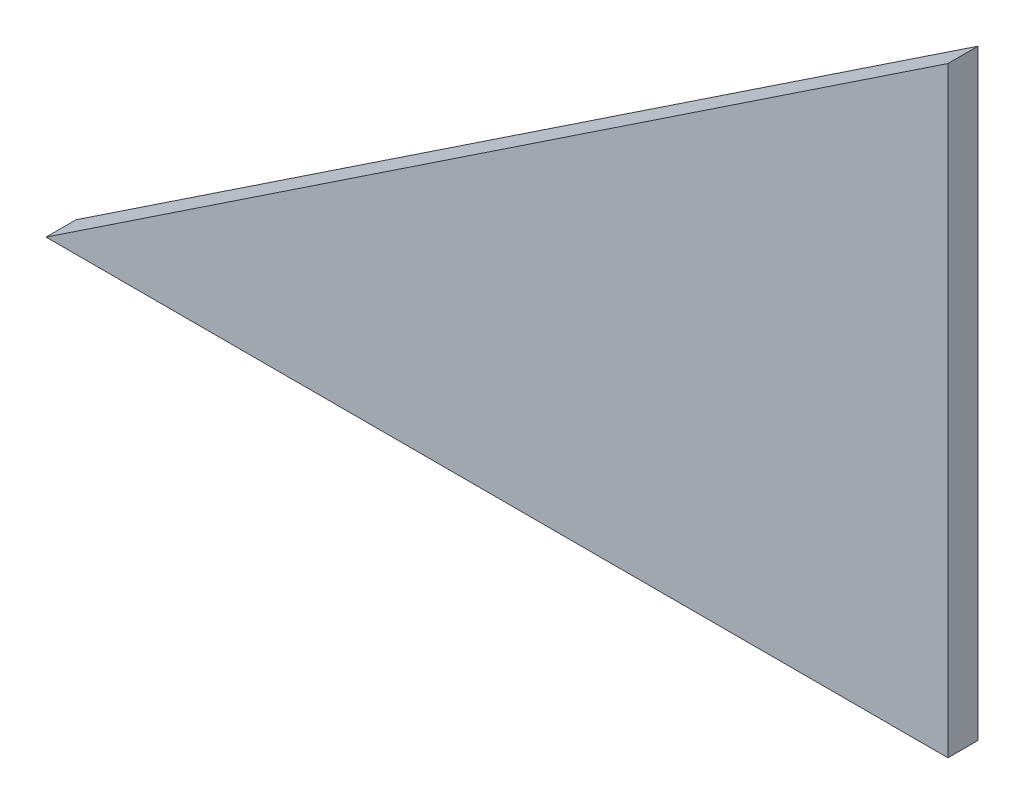
ISO-10303-21;
HEADER;
FILE_DESCRIPTION(('STEP AP214'),'2;1');
FILE_NAME('part.step','',(''),(''),'','','');
FILE_SCHEMA(('AUTOMOTIVE_DESIGN { 1 0 10303 214 1 1 1 1 }'));
ENDSEC;
DATA;
#1=APPLICATION_CONTEXT('core data for automotive mechanical design processes');
#2=APPLICATION_PROTOCOL_DEFINITION('international standard','automotive_design',2000,#1);
#3=PRODUCT_CONTEXT('',#1,'mechanical');
#4=PRODUCT('Part','Part','',(#3));
#5=PRODUCT_RELATED_PRODUCT_CATEGORY('part','',(#4));
#6=PRODUCT_DEFINITION_FORMATION('','',#4);
#7=PRODUCT_DEFINITION_CONTEXT('part definition',#1,'design');
#8=PRODUCT_DEFINITION('design','',#6,#7);
#9=PRODUCT_DEFINITION_SHAPE('','',#8);
#10=(LENGTH_UNIT() NAMED_UNIT(*) SI_UNIT(.MILLI.,.METRE.));
#11=(NAMED_UNIT(*) PLANE_ANGLE_UNIT() SI_UNIT($,.RADIAN.));
#12=(NAMED_UNIT(*) SI_UNIT($,.STERADIAN.) SOLID_ANGLE_UNIT());
#13=UNCERTAINTY_MEASURE_WITH_UNIT(LENGTH_MEASURE(1.E-05),#10,'distance_accuracy_value','');
#14=(GEOMETRIC_REPRESENTATION_CONTEXT(3) GLOBAL_UNCERTAINTY_ASSIGNED_CONTEXT((#13)) GLOBAL_UNIT_ASSIGNED_CONTEXT((#10,
#11,#12)) REPRESENTATION_CONTEXT('',''));
#15=CARTESIAN_POINT('',(0.,0.,0.));
#16=DIRECTION('',(0.,0.,1.));
#17=DIRECTION('',(1.,0.,0.));
#18=AXIS2_PLACEMENT_3D('',#15,#16,#17);
#19=CARTESIAN_POINT('',(158.709631061405,11.9600810738256,22.4064867546874));
#20=DIRECTION('',(0.,1.,0.));
#21=DIRECTION('',(0.,0.,1.));
#22=AXIS2_PLACEMENT_3D('',#19,#20,#21);
#23=PLANE('',#22);
#24=DIRECTION('',(-1.,0.,0.));
#25=VECTOR('',#24,1.);
#26=CARTESIAN_POINT('',(158.709631061405,11.9600810738256,23.6764867546874));
#27=LINE('',#26,#25);
#28=CARTESIAN_POINT('',(196.809631061405,11.9600810738256,23.6764867546874));
#29=VERTEX_POINT('',#28);
#30=CARTESIAN_POINT('',(158.709631061405,11.9600810738256,23.6764867546874));
#31=VERTEX_POINT('',#30);
#32=EDGE_CURVE('E86',#29,#31,#27,.T.);
#33=ORIENTED_EDGE('',*,*,#32,.T.);
#34=DIRECTION('',(0.,0.,1.));
#35=VECTOR('',#34,1.);
#36=CARTESIAN_POINT('',(158.709631061405,11.9600810738256,22.4064867546874));
#37=LINE('',#36,#35);
#38=CARTESIAN_POINT('',(158.709631061405,11.9600810738256,22.4064867546874));
#39=VERTEX_POINT('',#38);
#40=EDGE_CURVE('E11',#39,#31,#37,.T.);
#41=ORIENTED_EDGE('',*,*,#40,.F.);
#42=DIRECTION('',(-1.,0.,0.));
#43=VECTOR('',#42,1.);
#44=CARTESIAN_POINT('',(158.709631061405,11.9600810738256,22.4064867546874));
#45=LINE('',#44,#43);
#46=CARTESIAN_POINT('',(196.809631061405,11.9600810738256,22.4064867546874));
#47=VERTEX_POINT('',#46);
#48=EDGE_CURVE('E78',#47,#39,#45,.T.);
#49=ORIENTED_EDGE('',*,*,#48,.F.);
#50=DIRECTION('',(0.,0.,1.));
#51=VECTOR('',#50,1.);
#52=CARTESIAN_POINT('',(196.809631061405,11.9600810738256,22.4064867546874));
#53=LINE('',#52,#51);
#54=EDGE_CURVE('E87',#47,#29,#53,.T.);
#55=ORIENTED_EDGE('',*,*,#54,.T.);
#56=EDGE_LOOP('',(#33,#41,#49,#55));
#57=FACE_BOUND('',#56,.T.);
#58=ADVANCED_FACE('F37',(#57),#23,.F.);
#59=CARTESIAN_POINT('',(196.809631061405,37.3600810738256,22.4064867546874));
#60=DIRECTION('',(0.554700196225229,-0.832050294337844,0.));
#61=DIRECTION('',(0.832050294337844,0.554700196225229,0.));
#62=AXIS2_PLACEMENT_3D('',#59,#60,#61);
#63=PLANE('',#62);
#64=DIRECTION('',(0.832050294337844,0.554700196225229,0.));
#65=VECTOR('',#64,1.);
#66=CARTESIAN_POINT('',(196.809631061405,37.3600810738256,23.6764867546874));
#67=LINE('',#66,#65);
#68=CARTESIAN_POINT('',(196.809631061405,37.3600810738256,23.6764867546874));
#69=VERTEX_POINT('',#68);
#70=EDGE_CURVE('E65',#31,#69,#67,.T.);
#71=ORIENTED_EDGE('',*,*,#70,.T.);
#72=DIRECTION('',(0.,0.,1.));
#73=VECTOR('',#72,1.);
#74=CARTESIAN_POINT('',(196.809631061405,37.3600810738256,22.4064867546874));
#75=LINE('',#74,#73);
#76=CARTESIAN_POINT('',(196.809631061405,37.3600810738256,22.4064867546874));
#77=VERTEX_POINT('',#76);
#78=EDGE_CURVE('E45',#77,#69,#75,.T.);
#79=ORIENTED_EDGE('',*,*,#78,.F.);
#80=DIRECTION('',(0.832050294337844,0.554700196225229,0.));
#81=VECTOR('',#80,1.);
#82=CARTESIAN_POINT('',(196.809631061405,37.3600810738256,22.4064867546874));
#83=LINE('',#82,#81);
#84=EDGE_CURVE('E73',#39,#77,#83,.T.);
#85=ORIENTED_EDGE('',*,*,#84,.F.);
#86=ORIENTED_EDGE('',*,*,#40,.T.);
#87=EDGE_LOOP('',(#71,#79,#85,#86));
#88=FACE_BOUND('',#87,.T.);
#89=ADVANCED_FACE('F74',(#88),#63,.F.);
#90=CARTESIAN_POINT('',(196.809631061405,11.9600810738256,22.4064867546874));
#91=DIRECTION('',(-1.,0.,0.));
#92=DIRECTION('',(0.,0.,1.));
#93=AXIS2_PLACEMENT_3D('',#90,#91,#92);
#94=PLANE('',#93);
#95=DIRECTION('',(0.,-1.,0.));
#96=VECTOR('',#95,1.);
#97=CARTESIAN_POINT('',(196.809631061405,11.9600810738256,23.6764867546874));
#98=LINE('',#97,#96);
#99=EDGE_CURVE('E70',#69,#29,#98,.T.);
#100=ORIENTED_EDGE('',*,*,#99,.T.);
#101=ORIENTED_EDGE('',*,*,#54,.F.);
#102=DIRECTION('',(0.,-1.,0.));
#103=VECTOR('',#102,1.);
#104=CARTESIAN_POINT('',(196.809631061405,11.9600810738256,22.4064867546874));
#105=LINE('',#104,#103);
#106=EDGE_CURVE('E53',#77,#47,#105,.T.);
#107=ORIENTED_EDGE('',*,*,#106,.F.);
#108=ORIENTED_EDGE('',*,*,#78,.T.);
#109=EDGE_LOOP('',(#100,#101,#107,#108));
#110=FACE_BOUND('',#109,.T.);
#111=ADVANCED_FACE('F96',(#110),#94,.F.);
#112=CARTESIAN_POINT('',(0.,0.,22.4064867546874));
#113=DIRECTION('',(0.,0.,1.));
#114=DIRECTION('',(0.,-1.,0.));
#115=AXIS2_PLACEMENT_3D('',#112,#113,#114);
#116=PLANE('',#115);
#117=ORIENTED_EDGE('',*,*,#48,.T.);
#118=ORIENTED_EDGE('',*,*,#84,.T.);
#119=ORIENTED_EDGE('',*,*,#106,.T.);
#120=EDGE_LOOP('',(#117,#118,#119));
#121=FACE_BOUND('',#120,.T.);
#122=ADVANCED_FACE('F81',(#121),#116,.F.);
#123=CARTESIAN_POINT('',(0.,0.,23.6764867546874));
#124=DIRECTION('',(0.,0.,1.));
#125=DIRECTION('',(0.,-1.,0.));
#126=AXIS2_PLACEMENT_3D('',#123,#124,#125);
#127=PLANE('',#126);
#128=ORIENTED_EDGE('',*,*,#32,.F.);
#129=ORIENTED_EDGE('',*,*,#99,.F.);
#130=ORIENTED_EDGE('',*,*,#70,.F.);
#131=EDGE_LOOP('',(#128,#129,#130));
#132=FACE_BOUND('',#131,.T.);
#133=ADVANCED_FACE('F97',(#132),#127,.T.);
#134=CLOSED_SHELL('',(#58,#89,#111,#122,#133));
#135=MANIFOLD_SOLID_BREP('B2',#134);
#136=ADVANCED_BREP_SHAPE_REPRESENTATION('',(#18,#135),#14);
#137=SHAPE_DEFINITION_REPRESENTATION(#9,#136);
ENDSEC;
END-ISO-10303-21;
